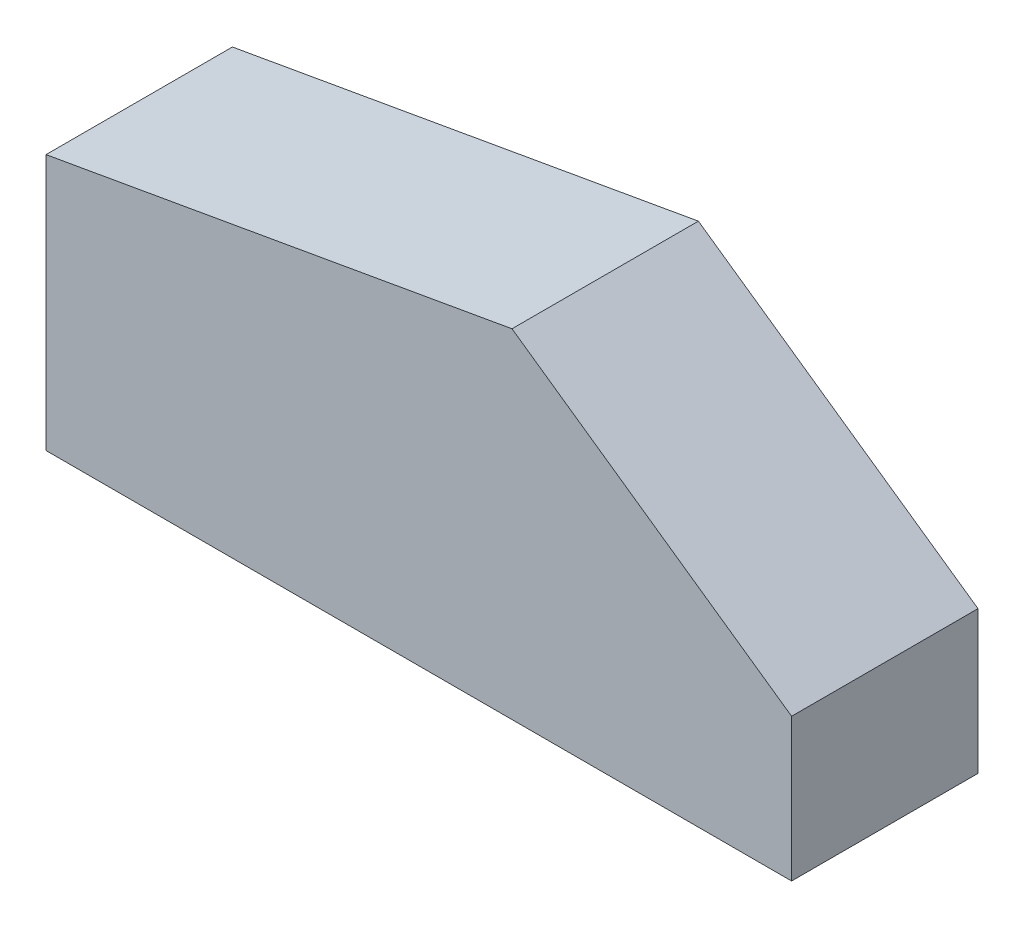
ISO-10303-21;
HEADER;
FILE_DESCRIPTION(('STEP AP214'),'2;1');
FILE_NAME('part.step','',(''),(''),'','','');
FILE_SCHEMA(('AUTOMOTIVE_DESIGN { 1 0 10303 214 1 1 1 1 }'));
ENDSEC;
DATA;
#1=APPLICATION_CONTEXT('core data for automotive mechanical design processes');
#2=APPLICATION_PROTOCOL_DEFINITION('international standard','automotive_design',2000,#1);
#3=PRODUCT_CONTEXT('',#1,'mechanical');
#4=PRODUCT('Part','Part','',(#3));
#5=PRODUCT_RELATED_PRODUCT_CATEGORY('part','',(#4));
#6=PRODUCT_DEFINITION_FORMATION('','',#4);
#7=PRODUCT_DEFINITION_CONTEXT('part definition',#1,'design');
#8=PRODUCT_DEFINITION('design','',#6,#7);
#9=PRODUCT_DEFINITION_SHAPE('','',#8);
#10=(LENGTH_UNIT() NAMED_UNIT(*) SI_UNIT(.MILLI.,.METRE.));
#11=(NAMED_UNIT(*) PLANE_ANGLE_UNIT() SI_UNIT($,.RADIAN.));
#12=(NAMED_UNIT(*) SI_UNIT($,.STERADIAN.) SOLID_ANGLE_UNIT());
#13=UNCERTAINTY_MEASURE_WITH_UNIT(LENGTH_MEASURE(1.E-05),#10,'distance_accuracy_value','');
#14=(GEOMETRIC_REPRESENTATION_CONTEXT(3) GLOBAL_UNCERTAINTY_ASSIGNED_CONTEXT((#13)) GLOBAL_UNIT_ASSIGNED_CONTEXT((#10,
#11,#12)) REPRESENTATION_CONTEXT('',''));
#15=CARTESIAN_POINT('',(0.,0.,0.));
#16=DIRECTION('',(0.,0.,1.));
#17=DIRECTION('',(1.,0.,0.));
#18=AXIS2_PLACEMENT_3D('',#15,#16,#17);
#19=CARTESIAN_POINT('',(0.,13.75,10.));
#20=DIRECTION('',(1.,0.,0.));
#21=DIRECTION('',(0.,1.,0.));
#22=AXIS2_PLACEMENT_3D('',#19,#20,#21);
#23=PLANE('',#22);
#24=DIRECTION('',(0.,-1.,0.));
#25=VECTOR('',#24,1.);
#26=CARTESIAN_POINT('',(0.,13.75,0.));
#27=LINE('',#26,#25);
#28=CARTESIAN_POINT('',(0.,13.75,0.));
#29=VERTEX_POINT('',#28);
#30=CARTESIAN_POINT('',(0.,0.,0.));
#31=VERTEX_POINT('',#30);
#32=EDGE_CURVE('E111',#29,#31,#27,.T.);
#33=ORIENTED_EDGE('',*,*,#32,.T.);
#34=DIRECTION('',(0.,0.,-1.));
#35=VECTOR('',#34,1.);
#36=CARTESIAN_POINT('',(0.,0.,10.));
#37=LINE('',#36,#35);
#38=CARTESIAN_POINT('',(0.,0.,10.));
#39=VERTEX_POINT('',#38);
#40=EDGE_CURVE('E11',#39,#31,#37,.T.);
#41=ORIENTED_EDGE('',*,*,#40,.F.);
#42=DIRECTION('',(0.,-1.,0.));
#43=VECTOR('',#42,1.);
#44=CARTESIAN_POINT('',(0.,13.75,10.));
#45=LINE('',#44,#43);
#46=CARTESIAN_POINT('',(0.,13.75,10.));
#47=VERTEX_POINT('',#46);
#48=EDGE_CURVE('E119',#47,#39,#45,.T.);
#49=ORIENTED_EDGE('',*,*,#48,.F.);
#50=DIRECTION('',(0.,0.,-1.));
#51=VECTOR('',#50,1.);
#52=CARTESIAN_POINT('',(0.,13.75,10.));
#53=LINE('',#52,#51);
#54=EDGE_CURVE('E107',#47,#29,#53,.T.);
#55=ORIENTED_EDGE('',*,*,#54,.T.);
#56=EDGE_LOOP('',(#33,#41,#49,#55));
#57=FACE_BOUND('',#56,.T.);
#58=ADVANCED_FACE('F37',(#57),#23,.F.);
#59=CARTESIAN_POINT('',(0.,0.,10.));
#60=DIRECTION('',(0.,1.,0.));
#61=DIRECTION('',(0.,0.,1.));
#62=AXIS2_PLACEMENT_3D('',#59,#60,#61);
#63=PLANE('',#62);
#64=DIRECTION('',(1.,0.,0.));
#65=VECTOR('',#64,1.);
#66=CARTESIAN_POINT('',(0.,0.,0.));
#67=LINE('',#66,#65);
#68=CARTESIAN_POINT('',(40.,0.,0.));
#69=VERTEX_POINT('',#68);
#70=EDGE_CURVE('E114',#31,#69,#67,.T.);
#71=ORIENTED_EDGE('',*,*,#70,.T.);
#72=DIRECTION('',(0.,0.,-1.));
#73=VECTOR('',#72,1.);
#74=CARTESIAN_POINT('',(40.,0.,10.));
#75=LINE('',#74,#73);
#76=CARTESIAN_POINT('',(40.,0.,10.));
#77=VERTEX_POINT('',#76);
#78=EDGE_CURVE('E45',#77,#69,#75,.T.);
#79=ORIENTED_EDGE('',*,*,#78,.F.);
#80=DIRECTION('',(1.,0.,0.));
#81=VECTOR('',#80,1.);
#82=CARTESIAN_POINT('',(0.,0.,10.));
#83=LINE('',#82,#81);
#84=EDGE_CURVE('E87',#39,#77,#83,.T.);
#85=ORIENTED_EDGE('',*,*,#84,.F.);
#86=ORIENTED_EDGE('',*,*,#40,.T.);
#87=EDGE_LOOP('',(#71,#79,#85,#86));
#88=FACE_BOUND('',#87,.T.);
#89=ADVANCED_FACE('F138',(#88),#63,.F.);
#90=CARTESIAN_POINT('',(40.,0.,10.));
#91=DIRECTION('',(-1.,0.,0.));
#92=DIRECTION('',(0.,0.,1.));
#93=AXIS2_PLACEMENT_3D('',#90,#91,#92);
#94=PLANE('',#93);
#95=DIRECTION('',(0.,1.,0.));
#96=VECTOR('',#95,1.);
#97=CARTESIAN_POINT('',(40.,0.,0.));
#98=LINE('',#97,#96);
#99=CARTESIAN_POINT('',(40.,7.65506144456578,0.));
#100=VERTEX_POINT('',#99);
#101=EDGE_CURVE('E102',#69,#100,#98,.T.);
#102=ORIENTED_EDGE('',*,*,#101,.T.);
#103=DIRECTION('',(0.,0.,-1.));
#104=VECTOR('',#103,1.);
#105=CARTESIAN_POINT('',(40.,7.65506144456578,10.));
#106=LINE('',#105,#104);
#107=CARTESIAN_POINT('',(40.,7.65506144456578,10.));
#108=VERTEX_POINT('',#107);
#109=EDGE_CURVE('E99',#108,#100,#106,.T.);
#110=ORIENTED_EDGE('',*,*,#109,.F.);
#111=DIRECTION('',(0.,1.,0.));
#112=VECTOR('',#111,1.);
#113=CARTESIAN_POINT('',(40.,0.,10.));
#114=LINE('',#113,#112);
#115=EDGE_CURVE('E91',#77,#108,#114,.T.);
#116=ORIENTED_EDGE('',*,*,#115,.F.);
#117=ORIENTED_EDGE('',*,*,#78,.T.);
#118=EDGE_LOOP('',(#102,#110,#116,#117));
#119=FACE_BOUND('',#118,.T.);
#120=ADVANCED_FACE('F100',(#119),#94,.F.);
#121=CARTESIAN_POINT('',(40.,7.65506144456578,10.));
#122=DIRECTION('',(-0.57357643635105,-0.819152044288989,0.));
#123=DIRECTION('',(0.819152044288989,-0.57357643635105,0.));
#124=AXIS2_PLACEMENT_3D('',#121,#122,#123);
#125=PLANE('',#124);
#126=DIRECTION('',(-0.819152044288989,0.57357643635105,0.));
#127=VECTOR('',#126,1.);
#128=CARTESIAN_POINT('',(40.,7.65506144456578,0.));
#129=LINE('',#128,#127);
#130=CARTESIAN_POINT('',(25.,18.1581745177115,0.));
#131=VERTEX_POINT('',#130);
#132=EDGE_CURVE('E73',#100,#131,#129,.T.);
#133=ORIENTED_EDGE('',*,*,#132,.T.);
#134=DIRECTION('',(0.,0.,-1.));
#135=VECTOR('',#134,1.);
#136=CARTESIAN_POINT('',(25.,18.1581745177115,10.));
#137=LINE('',#136,#135);
#138=CARTESIAN_POINT('',(25.,18.1581745177115,10.));
#139=VERTEX_POINT('',#138);
#140=EDGE_CURVE('E103',#139,#131,#137,.T.);
#141=ORIENTED_EDGE('',*,*,#140,.F.);
#142=DIRECTION('',(-0.819152044288989,0.57357643635105,0.));
#143=VECTOR('',#142,1.);
#144=CARTESIAN_POINT('',(40.,7.65506144456578,10.));
#145=LINE('',#144,#143);
#146=EDGE_CURVE('E95',#108,#139,#145,.T.);
#147=ORIENTED_EDGE('',*,*,#146,.F.);
#148=ORIENTED_EDGE('',*,*,#109,.T.);
#149=EDGE_LOOP('',(#133,#141,#147,#148));
#150=FACE_BOUND('',#149,.T.);
#151=ADVANCED_FACE('F105',(#150),#125,.F.);
#152=CARTESIAN_POINT('',(25.,18.1581745177115,10.));
#153=DIRECTION('',(0.173648177666927,-0.984807753012209,0.));
#154=DIRECTION('',(0.984807753012209,0.173648177666927,0.));
#155=AXIS2_PLACEMENT_3D('',#152,#153,#154);
#156=PLANE('',#155);
#157=DIRECTION('',(-0.984807753012209,-0.173648177666927,0.));
#158=VECTOR('',#157,1.);
#159=CARTESIAN_POINT('',(25.,18.1581745177115,0.));
#160=LINE('',#159,#158);
#161=EDGE_CURVE('E79',#131,#29,#160,.T.);
#162=ORIENTED_EDGE('',*,*,#161,.T.);
#163=ORIENTED_EDGE('',*,*,#54,.F.);
#164=DIRECTION('',(-0.984807753012209,-0.173648177666927,0.));
#165=VECTOR('',#164,1.);
#166=CARTESIAN_POINT('',(25.,18.1581745177115,10.));
#167=LINE('',#166,#165);
#168=EDGE_CURVE('E53',#139,#47,#167,.T.);
#169=ORIENTED_EDGE('',*,*,#168,.F.);
#170=ORIENTED_EDGE('',*,*,#140,.T.);
#171=EDGE_LOOP('',(#162,#163,#169,#170));
#172=FACE_BOUND('',#171,.T.);
#173=ADVANCED_FACE('F127',(#172),#156,.F.);
#174=CARTESIAN_POINT('',(0.,0.,10.));
#175=DIRECTION('',(0.,0.,1.));
#176=DIRECTION('',(1.,0.,0.));
#177=AXIS2_PLACEMENT_3D('',#174,#175,#176);
#178=PLANE('',#177);
#179=ORIENTED_EDGE('',*,*,#48,.T.);
#180=ORIENTED_EDGE('',*,*,#84,.T.);
#181=ORIENTED_EDGE('',*,*,#115,.T.);
#182=ORIENTED_EDGE('',*,*,#146,.T.);
#183=ORIENTED_EDGE('',*,*,#168,.T.);
#184=EDGE_LOOP('',(#179,#180,#181,#182,#183));
#185=FACE_BOUND('',#184,.T.);
#186=ADVANCED_FACE('F93',(#185),#178,.T.);
#187=CARTESIAN_POINT('',(0.,0.,0.));
#188=DIRECTION('',(0.,0.,1.));
#189=DIRECTION('',(1.,0.,0.));
#190=AXIS2_PLACEMENT_3D('',#187,#188,#189);
#191=PLANE('',#190);
#192=ORIENTED_EDGE('',*,*,#32,.F.);
#193=ORIENTED_EDGE('',*,*,#161,.F.);
#194=ORIENTED_EDGE('',*,*,#132,.F.);
#195=ORIENTED_EDGE('',*,*,#101,.F.);
#196=ORIENTED_EDGE('',*,*,#70,.F.);
#197=EDGE_LOOP('',(#192,#193,#194,#195,#196));
#198=FACE_BOUND('',#197,.T.);
#199=ADVANCED_FACE('F123',(#198),#191,.F.);
#200=CLOSED_SHELL('',(#58,#89,#120,#151,#173,#186,#199));
#201=MANIFOLD_SOLID_BREP('B2',#200);
#202=ADVANCED_BREP_SHAPE_REPRESENTATION('',(#18,#201),#14);
#203=SHAPE_DEFINITION_REPRESENTATION(#9,#202);
ENDSEC;
END-ISO-10303-21;
